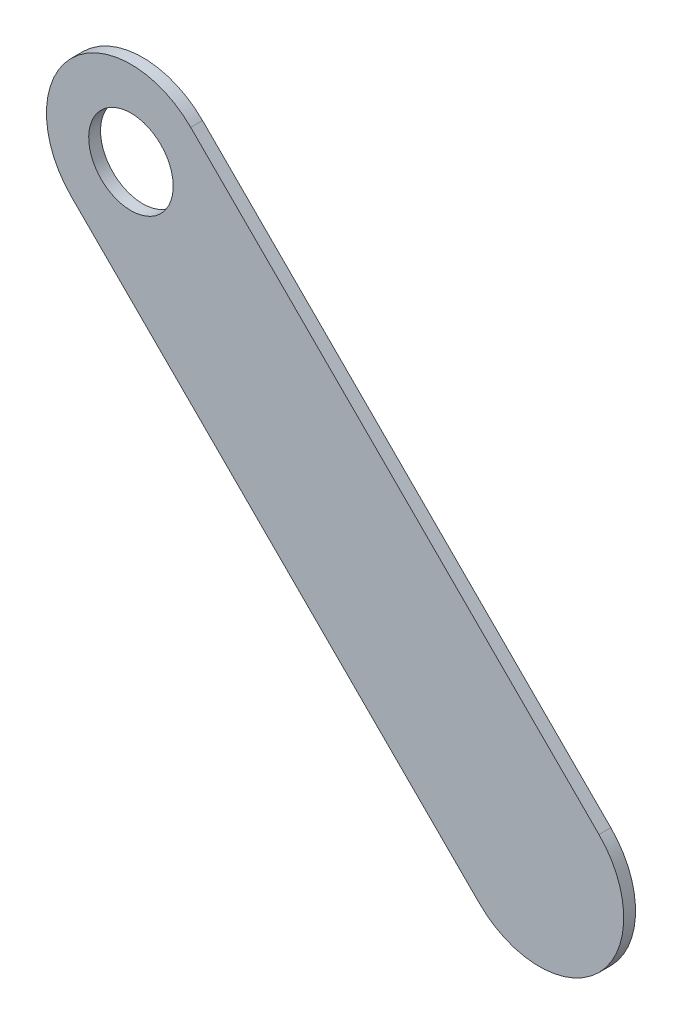
ISO-10303-21;
HEADER;
FILE_DESCRIPTION(('STEP AP214'),'2;1');
FILE_NAME('part.step','',(''),(''),'','','');
FILE_SCHEMA(('AUTOMOTIVE_DESIGN { 1 0 10303 214 1 1 1 1 }'));
ENDSEC;
DATA;
#1=APPLICATION_CONTEXT('core data for automotive mechanical design processes');
#2=APPLICATION_PROTOCOL_DEFINITION('international standard','automotive_design',2000,#1);
#3=PRODUCT_CONTEXT('',#1,'mechanical');
#4=PRODUCT('Part','Part','',(#3));
#5=PRODUCT_RELATED_PRODUCT_CATEGORY('part','',(#4));
#6=PRODUCT_DEFINITION_FORMATION('','',#4);
#7=PRODUCT_DEFINITION_CONTEXT('part definition',#1,'design');
#8=PRODUCT_DEFINITION('design','',#6,#7);
#9=PRODUCT_DEFINITION_SHAPE('','',#8);
#10=(LENGTH_UNIT() NAMED_UNIT(*) SI_UNIT(.MILLI.,.METRE.));
#11=(NAMED_UNIT(*) PLANE_ANGLE_UNIT() SI_UNIT($,.RADIAN.));
#12=(NAMED_UNIT(*) SI_UNIT($,.STERADIAN.) SOLID_ANGLE_UNIT());
#13=UNCERTAINTY_MEASURE_WITH_UNIT(LENGTH_MEASURE(1.E-05),#10,'distance_accuracy_value','');
#14=(GEOMETRIC_REPRESENTATION_CONTEXT(3) GLOBAL_UNCERTAINTY_ASSIGNED_CONTEXT((#13)) GLOBAL_UNIT_ASSIGNED_CONTEXT((#10,
#11,#12)) REPRESENTATION_CONTEXT('',''));
#15=CARTESIAN_POINT('',(0.,0.,0.));
#16=DIRECTION('',(0.,0.,1.));
#17=DIRECTION('',(1.,0.,0.));
#18=AXIS2_PLACEMENT_3D('',#15,#16,#17);
#19=CARTESIAN_POINT('',(124.14,-114.59,-0.045));
#20=DIRECTION('',(0.,0.,-1.));
#21=DIRECTION('',(0.,-1.,0.));
#22=AXIS2_PLACEMENT_3D('',#19,#20,#21);
#23=CYLINDRICAL_SURFACE('',#22,0.125);
#24=CARTESIAN_POINT('',(124.14,-114.59,1.6));
#25=DIRECTION('',(0.,0.,-1.));
#26=DIRECTION('',(0.,-1.,0.));
#27=AXIS2_PLACEMENT_3D('',#24,#25,#26);
#28=CIRCLE('',#27,0.125);
#29=CARTESIAN_POINT('',(124.14,-114.715,1.6));
#30=VERTEX_POINT('',#29);
#31=EDGE_CURVE('E118',#30,#30,#28,.T.);
#32=ORIENTED_EDGE('',*,*,#31,.T.);
#33=DIRECTION('',(0.,0.,1.));
#34=VECTOR('',#33,1.);
#35=CARTESIAN_POINT('',(124.14,-114.715,-0.045));
#36=LINE('',#35,#34);
#37=CARTESIAN_POINT('',(124.14,-114.715,1.635));
#38=VERTEX_POINT('',#37);
#39=EDGE_CURVE('E11',#30,#38,#36,.T.);
#40=ORIENTED_EDGE('',*,*,#39,.T.);
#41=CARTESIAN_POINT('',(124.14,-114.59,1.635));
#42=DIRECTION('',(0.,0.,-1.));
#43=DIRECTION('',(0.,-1.,0.));
#44=AXIS2_PLACEMENT_3D('',#41,#42,#43);
#45=CIRCLE('',#44,0.125);
#46=EDGE_CURVE('E27',#38,#38,#45,.T.);
#47=ORIENTED_EDGE('',*,*,#46,.F.);
#48=ORIENTED_EDGE('',*,*,#39,.F.);
#49=EDGE_LOOP('',(#32,#40,#47,#48));
#50=FACE_BOUND('',#49,.T.);
#51=ADVANCED_FACE('F17',(#50),#23,.F.);
#52=CARTESIAN_POINT('',(123.963223,-114.766776,1.6));
#53=DIRECTION('',(0.707106781186548,0.707106781186548,0.));
#54=DIRECTION('',(0.,0.,-1.));
#55=AXIS2_PLACEMENT_3D('',#52,#53,#54);
#56=PLANE('',#55);
#57=DIRECTION('',(0.707106781186548,-0.707106781186548,0.));
#58=VECTOR('',#57,1.);
#59=CARTESIAN_POINT('',(123.963223,-114.766776,1.6));
#60=LINE('',#59,#58);
#61=CARTESIAN_POINT('',(123.963223,-114.766776,1.6));
#62=VERTEX_POINT('',#61);
#63=CARTESIAN_POINT('',(125.171115,-115.974668,1.6));
#64=VERTEX_POINT('',#63);
#65=EDGE_CURVE('E115',#62,#64,#60,.T.);
#66=ORIENTED_EDGE('',*,*,#65,.T.);
#67=DIRECTION('',(0.,0.,1.));
#68=VECTOR('',#67,1.);
#69=CARTESIAN_POINT('',(125.171115,-115.974668,1.6));
#70=LINE('',#69,#68);
#71=CARTESIAN_POINT('',(125.171115,-115.974668,1.635));
#72=VERTEX_POINT('',#71);
#73=EDGE_CURVE('E83',#64,#72,#70,.T.);
#74=ORIENTED_EDGE('',*,*,#73,.T.);
#75=DIRECTION('',(0.707106781186548,-0.707106781186548,0.));
#76=VECTOR('',#75,1.);
#77=CARTESIAN_POINT('',(123.963223,-114.766776,1.635));
#78=LINE('',#77,#76);
#79=CARTESIAN_POINT('',(123.963223,-114.766776,1.635));
#80=VERTEX_POINT('',#79);
#81=EDGE_CURVE('E20',#80,#72,#78,.T.);
#82=ORIENTED_EDGE('',*,*,#81,.F.);
#83=DIRECTION('',(0.,0.,1.));
#84=VECTOR('',#83,1.);
#85=CARTESIAN_POINT('',(123.963223,-114.766776,1.6));
#86=LINE('',#85,#84);
#87=EDGE_CURVE('E126',#62,#80,#86,.T.);
#88=ORIENTED_EDGE('',*,*,#87,.F.);
#89=EDGE_LOOP('',(#66,#74,#82,#88));
#90=FACE_BOUND('',#89,.T.);
#91=ADVANCED_FACE('F143',(#90),#56,.F.);
#92=CARTESIAN_POINT('',(125.524668,-115.621115,1.635));
#93=DIRECTION('',(0.,0.,1.));
#94=DIRECTION('',(1.,0.,0.));
#95=AXIS2_PLACEMENT_3D('',#92,#93,#94);
#96=PLANE('',#95);
#97=ORIENTED_EDGE('',*,*,#46,.T.);
#98=EDGE_LOOP('',(#97));
#99=FACE_BOUND('',#98,.T.);
#100=DIRECTION('',(-0.707106781186548,0.707106781186548,0.));
#101=VECTOR('',#100,1.);
#102=CARTESIAN_POINT('',(125.524668,-115.621115,1.635));
#103=LINE('',#102,#101);
#104=CARTESIAN_POINT('',(125.524668,-115.621115,1.635));
#105=VERTEX_POINT('',#104);
#106=CARTESIAN_POINT('',(124.316776,-114.413223,1.635));
#107=VERTEX_POINT('',#106);
#108=EDGE_CURVE('E95',#105,#107,#103,.T.);
#109=ORIENTED_EDGE('',*,*,#108,.T.);
#110=CARTESIAN_POINT('',(124.1399995,-114.5899995,1.635));
#111=DIRECTION('',(0.,0.,1.));
#112=DIRECTION('',(0.707106781186548,0.707106781186548,0.));
#113=AXIS2_PLACEMENT_3D('',#110,#111,#112);
#114=CIRCLE('',#113,0.249999723809);
#115=EDGE_CURVE('E119',#107,#80,#114,.T.);
#116=ORIENTED_EDGE('',*,*,#115,.T.);
#117=ORIENTED_EDGE('',*,*,#81,.T.);
#118=CARTESIAN_POINT('',(125.3478915,-115.7978915,1.635));
#119=DIRECTION('',(0.,0.,1.));
#120=DIRECTION('',(-0.707106781186548,-0.707106781186548,0.));
#121=AXIS2_PLACEMENT_3D('',#118,#119,#120);
#122=CIRCLE('',#121,0.249999723809);
#123=EDGE_CURVE('E87',#72,#105,#122,.T.);
#124=ORIENTED_EDGE('',*,*,#123,.T.);
#125=EDGE_LOOP('',(#109,#116,#117,#124));
#126=FACE_BOUND('',#125,.T.);
#127=ADVANCED_FACE('F140',(#99,#126),#96,.T.);
#128=CARTESIAN_POINT('',(125.524668,-115.621115,1.6));
#129=DIRECTION('',(0.,0.,1.));
#130=DIRECTION('',(1.,0.,0.));
#131=AXIS2_PLACEMENT_3D('',#128,#129,#130);
#132=PLANE('',#131);
#133=ORIENTED_EDGE('',*,*,#31,.F.);
#134=EDGE_LOOP('',(#133));
#135=FACE_BOUND('',#134,.T.);
#136=CARTESIAN_POINT('',(125.3478915,-115.7978915,1.6));
#137=DIRECTION('',(0.,0.,1.));
#138=DIRECTION('',(-0.707106781186548,-0.707106781186548,0.));
#139=AXIS2_PLACEMENT_3D('',#136,#137,#138);
#140=CIRCLE('',#139,0.249999723809);
#141=CARTESIAN_POINT('',(125.524668,-115.621115,1.6));
#142=VERTEX_POINT('',#141);
#143=EDGE_CURVE('E76',#64,#142,#140,.T.);
#144=ORIENTED_EDGE('',*,*,#143,.F.);
#145=ORIENTED_EDGE('',*,*,#65,.F.);
#146=CARTESIAN_POINT('',(124.1399995,-114.5899995,1.6));
#147=DIRECTION('',(0.,0.,1.));
#148=DIRECTION('',(0.707106781186548,0.707106781186548,0.));
#149=AXIS2_PLACEMENT_3D('',#146,#147,#148);
#150=CIRCLE('',#149,0.249999723809);
#151=CARTESIAN_POINT('',(124.316776,-114.413223,1.6));
#152=VERTEX_POINT('',#151);
#153=EDGE_CURVE('E100',#152,#62,#150,.T.);
#154=ORIENTED_EDGE('',*,*,#153,.F.);
#155=DIRECTION('',(-0.707106781186548,0.707106781186548,0.));
#156=VECTOR('',#155,1.);
#157=CARTESIAN_POINT('',(125.524668,-115.621115,1.6));
#158=LINE('',#157,#156);
#159=EDGE_CURVE('E93',#142,#152,#158,.T.);
#160=ORIENTED_EDGE('',*,*,#159,.F.);
#161=EDGE_LOOP('',(#144,#145,#154,#160));
#162=FACE_BOUND('',#161,.T.);
#163=ADVANCED_FACE('F98',(#135,#162),#132,.F.);
#164=CARTESIAN_POINT('',(124.1399995,-114.5899995,1.6));
#165=DIRECTION('',(0.,0.,-1.));
#166=DIRECTION('',(0.707106781186548,0.707106781186548,0.));
#167=AXIS2_PLACEMENT_3D('',#164,#165,#166);
#168=CYLINDRICAL_SURFACE('',#167,0.249999723809);
#169=ORIENTED_EDGE('',*,*,#153,.T.);
#170=ORIENTED_EDGE('',*,*,#87,.T.);
#171=ORIENTED_EDGE('',*,*,#115,.F.);
#172=DIRECTION('',(0.,0.,1.));
#173=VECTOR('',#172,1.);
#174=CARTESIAN_POINT('',(124.316776,-114.413223,1.6));
#175=LINE('',#174,#173);
#176=EDGE_CURVE('E103',#152,#107,#175,.T.);
#177=ORIENTED_EDGE('',*,*,#176,.F.);
#178=EDGE_LOOP('',(#169,#170,#171,#177));
#179=FACE_BOUND('',#178,.T.);
#180=ADVANCED_FACE('F145',(#179),#168,.T.);
#181=CARTESIAN_POINT('',(125.3478915,-115.7978915,1.6));
#182=DIRECTION('',(0.,0.,-1.));
#183=DIRECTION('',(-0.707106781186548,-0.707106781186548,0.));
#184=AXIS2_PLACEMENT_3D('',#181,#182,#183);
#185=CYLINDRICAL_SURFACE('',#184,0.249999723809);
#186=ORIENTED_EDGE('',*,*,#143,.T.);
#187=DIRECTION('',(0.,0.,1.));
#188=VECTOR('',#187,1.);
#189=CARTESIAN_POINT('',(125.524668,-115.621115,1.6));
#190=LINE('',#189,#188);
#191=EDGE_CURVE('E80',#142,#105,#190,.T.);
#192=ORIENTED_EDGE('',*,*,#191,.T.);
#193=ORIENTED_EDGE('',*,*,#123,.F.);
#194=ORIENTED_EDGE('',*,*,#73,.F.);
#195=EDGE_LOOP('',(#186,#192,#193,#194));
#196=FACE_BOUND('',#195,.T.);
#197=ADVANCED_FACE('F78',(#196),#185,.T.);
#198=CARTESIAN_POINT('',(125.524668,-115.621115,1.6));
#199=DIRECTION('',(-0.707106781186548,-0.707106781186548,0.));
#200=DIRECTION('',(-0.707106781186548,0.707106781186548,0.));
#201=AXIS2_PLACEMENT_3D('',#198,#199,#200);
#202=PLANE('',#201);
#203=ORIENTED_EDGE('',*,*,#159,.T.);
#204=ORIENTED_EDGE('',*,*,#176,.T.);
#205=ORIENTED_EDGE('',*,*,#108,.F.);
#206=ORIENTED_EDGE('',*,*,#191,.F.);
#207=EDGE_LOOP('',(#203,#204,#205,#206));
#208=FACE_BOUND('',#207,.T.);
#209=ADVANCED_FACE('F91',(#208),#202,.F.);
#210=CLOSED_SHELL('',(#51,#91,#127,#163,#180,#197,#209));
#211=MANIFOLD_SOLID_BREP('B1',#210);
#212=ADVANCED_BREP_SHAPE_REPRESENTATION('',(#18,#211),#14);
#213=SHAPE_DEFINITION_REPRESENTATION(#9,#212);
ENDSEC;
END-ISO-10303-21;
